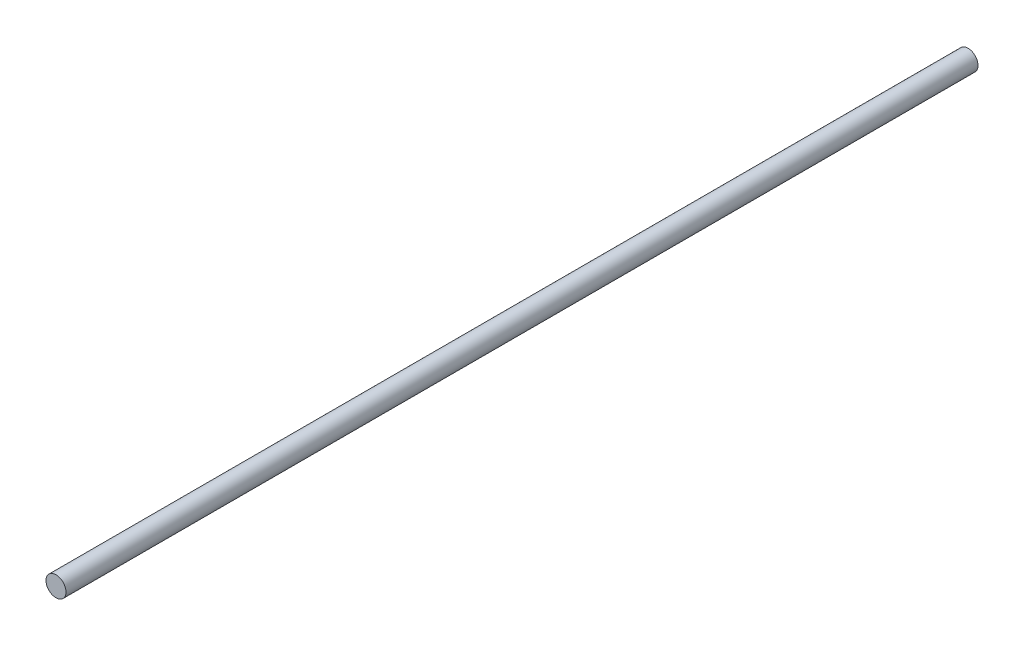
ISO-10303-21;
HEADER;
FILE_DESCRIPTION(('STEP AP214'),'2;1');
FILE_NAME('part.step','',(''),(''),'','','');
FILE_SCHEMA(('AUTOMOTIVE_DESIGN { 1 0 10303 214 1 1 1 1 }'));
ENDSEC;
DATA;
#1=APPLICATION_CONTEXT('core data for automotive mechanical design processes');
#2=APPLICATION_PROTOCOL_DEFINITION('international standard','automotive_design',2000,#1);
#3=PRODUCT_CONTEXT('',#1,'mechanical');
#4=PRODUCT('Part','Part','',(#3));
#5=PRODUCT_RELATED_PRODUCT_CATEGORY('part','',(#4));
#6=PRODUCT_DEFINITION_FORMATION('','',#4);
#7=PRODUCT_DEFINITION_CONTEXT('part definition',#1,'design');
#8=PRODUCT_DEFINITION('design','',#6,#7);
#9=PRODUCT_DEFINITION_SHAPE('','',#8);
#10=(LENGTH_UNIT() NAMED_UNIT(*) SI_UNIT(.MILLI.,.METRE.));
#11=(NAMED_UNIT(*) PLANE_ANGLE_UNIT() SI_UNIT($,.RADIAN.));
#12=(NAMED_UNIT(*) SI_UNIT($,.STERADIAN.) SOLID_ANGLE_UNIT());
#13=UNCERTAINTY_MEASURE_WITH_UNIT(LENGTH_MEASURE(1.E-05),#10,'distance_accuracy_value','');
#14=(GEOMETRIC_REPRESENTATION_CONTEXT(3) GLOBAL_UNCERTAINTY_ASSIGNED_CONTEXT((#13)) GLOBAL_UNIT_ASSIGNED_CONTEXT((#10,
#11,#12)) REPRESENTATION_CONTEXT('',''));
#15=CARTESIAN_POINT('',(0.,0.,0.));
#16=DIRECTION('',(0.,0.,1.));
#17=DIRECTION('',(1.,0.,0.));
#18=AXIS2_PLACEMENT_3D('',#15,#16,#17);
#19=CARTESIAN_POINT('',(0.,0.,365.));
#20=DIRECTION('',(0.,0.,-1.));
#21=DIRECTION('',(-1.,0.,0.));
#22=AXIS2_PLACEMENT_3D('',#19,#20,#21);
#23=CYLINDRICAL_SURFACE('',#22,4.);
#24=CARTESIAN_POINT('',(0.,0.,365.));
#25=DIRECTION('',(0.,0.,1.));
#26=DIRECTION('',(1.,0.,0.));
#27=AXIS2_PLACEMENT_3D('',#24,#25,#26);
#28=CIRCLE('',#27,4.);
#29=CARTESIAN_POINT('',(-4.,0.,365.));
#30=VERTEX_POINT('',#29);
#31=EDGE_CURVE('E10',#30,#30,#28,.T.);
#32=CARTESIAN_POINT('',(0.,0.,0.));
#33=DIRECTION('',(0.,0.,1.));
#34=DIRECTION('',(1.,0.,0.));
#35=AXIS2_PLACEMENT_3D('',#32,#33,#34);
#36=CIRCLE('',#35,4.);
#37=CARTESIAN_POINT('',(-4.,0.,0.));
#38=VERTEX_POINT('',#37);
#39=EDGE_CURVE('E40',#38,#38,#36,.T.);
#40=CARTESIAN_POINT('',(-4.,0.,365.));
#41=CARTESIAN_POINT('',(-4.,0.,361.197916666667));
#42=CARTESIAN_POINT('',(-4.,0.,357.395833333333));
#43=CARTESIAN_POINT('',(-4.,0.,349.791666666667));
#44=CARTESIAN_POINT('',(-4.,0.,345.989583333333));
#45=CARTESIAN_POINT('',(-4.,0.,338.385416666667));
#46=CARTESIAN_POINT('',(-4.,0.,334.583333333333));
#47=CARTESIAN_POINT('',(-4.,0.,326.979166666667));
#48=CARTESIAN_POINT('',(-4.,0.,323.177083333333));
#49=CARTESIAN_POINT('',(-4.,0.,315.572916666667));
#50=CARTESIAN_POINT('',(-4.,0.,311.770833333333));
#51=CARTESIAN_POINT('',(-4.,0.,304.166666666667));
#52=CARTESIAN_POINT('',(-4.,0.,300.364583333333));
#53=CARTESIAN_POINT('',(-4.,0.,292.760416666667));
#54=CARTESIAN_POINT('',(-4.,0.,288.958333333333));
#55=CARTESIAN_POINT('',(-4.,0.,281.354166666667));
#56=CARTESIAN_POINT('',(-4.,0.,277.552083333333));
#57=CARTESIAN_POINT('',(-4.,0.,269.947916666667));
#58=CARTESIAN_POINT('',(-4.,0.,266.145833333333));
#59=CARTESIAN_POINT('',(-4.,0.,258.541666666667));
#60=CARTESIAN_POINT('',(-4.,0.,254.739583333333));
#61=CARTESIAN_POINT('',(-4.,0.,247.135416666667));
#62=CARTESIAN_POINT('',(-4.,0.,243.333333333333));
#63=CARTESIAN_POINT('',(-4.,0.,235.729166666667));
#64=CARTESIAN_POINT('',(-4.,0.,231.927083333333));
#65=CARTESIAN_POINT('',(-4.,0.,224.322916666667));
#66=CARTESIAN_POINT('',(-4.,0.,220.520833333333));
#67=CARTESIAN_POINT('',(-4.,0.,212.916666666667));
#68=CARTESIAN_POINT('',(-4.,0.,209.114583333333));
#69=CARTESIAN_POINT('',(-4.,0.,201.510416666667));
#70=CARTESIAN_POINT('',(-4.,0.,197.708333333333));
#71=CARTESIAN_POINT('',(-4.,0.,190.104166666667));
#72=CARTESIAN_POINT('',(-4.,0.,186.302083333333));
#73=CARTESIAN_POINT('',(-4.,0.,178.697916666667));
#74=CARTESIAN_POINT('',(-4.,0.,174.895833333333));
#75=CARTESIAN_POINT('',(-4.,0.,167.291666666667));
#76=CARTESIAN_POINT('',(-4.,0.,163.489583333333));
#77=CARTESIAN_POINT('',(-4.,0.,155.885416666667));
#78=CARTESIAN_POINT('',(-4.,0.,152.083333333333));
#79=CARTESIAN_POINT('',(-4.,0.,144.479166666667));
#80=CARTESIAN_POINT('',(-4.,0.,140.677083333333));
#81=CARTESIAN_POINT('',(-4.,0.,133.072916666667));
#82=CARTESIAN_POINT('',(-4.,0.,129.270833333333));
#83=CARTESIAN_POINT('',(-4.,0.,121.666666666667));
#84=CARTESIAN_POINT('',(-4.,0.,117.864583333333));
#85=CARTESIAN_POINT('',(-4.,0.,110.260416666667));
#86=CARTESIAN_POINT('',(-4.,0.,106.458333333333));
#87=CARTESIAN_POINT('',(-4.,0.,98.8541666666666));
#88=CARTESIAN_POINT('',(-4.,0.,95.0520833333333));
#89=CARTESIAN_POINT('',(-4.,0.,87.4479166666666));
#90=CARTESIAN_POINT('',(-4.,0.,83.6458333333333));
#91=CARTESIAN_POINT('',(-4.,0.,76.0416666666666));
#92=CARTESIAN_POINT('',(-4.,0.,72.2395833333333));
#93=CARTESIAN_POINT('',(-4.,0.,64.6354166666666));
#94=CARTESIAN_POINT('',(-4.,0.,60.8333333333333));
#95=CARTESIAN_POINT('',(-4.,0.,53.2291666666666));
#96=CARTESIAN_POINT('',(-4.,0.,49.4270833333333));
#97=CARTESIAN_POINT('',(-4.,0.,41.8229166666666));
#98=CARTESIAN_POINT('',(-4.,0.,38.0208333333333));
#99=CARTESIAN_POINT('',(-4.,0.,30.4166666666666));
#100=CARTESIAN_POINT('',(-4.,0.,26.6145833333333));
#101=CARTESIAN_POINT('',(-4.,0.,19.0104166666666));
#102=CARTESIAN_POINT('',(-4.,0.,15.2083333333333));
#103=CARTESIAN_POINT('',(-4.,0.,7.60416666666662));
#104=CARTESIAN_POINT('',(-4.,0.,3.80208333333328));
#105=CARTESIAN_POINT('',(-4.,0.,0.));
#106=B_SPLINE_CURVE_WITH_KNOTS('',3,(#40,#41,#42,#43,#44,#45,#46,#47,#48,#49,#50,#51,#52,#53,
#54,#55,#56,#57,#58,#59,#60,#61,#62,#63,#64,#65,#66,#67,#68,#69,#70,#71,#72,#73,#74,#75,#76,#77,
#78,#79,#80,#81,#82,#83,#84,#85,#86,#87,#88,#89,#90,#91,#92,#93,#94,#95,#96,#97,#98,#99,#100,
#101,#102,#103,#104,#105),.UNSPECIFIED.,.F.,.F.,(4,2,2,2,2,2,2,2,2,2,2,2,2,2,2,2,2,2,2,2,2,2,2,
2,2,2,2,2,2,2,2,2,4),(0.,11.40625,22.8125,34.21875,45.625,57.03125,68.4375,79.8437499999999,
91.25,102.65625,114.0625,125.46875,136.875,148.28125,159.6875,171.09375,182.5,193.90625,
205.3125,216.71875,228.125,239.53125,250.9375,262.34375,273.75,285.15625,296.5625,307.96875,
319.375,330.78125,342.1875,353.59375,365.),.UNSPECIFIED.);
#107=EDGE_CURVE('BSEAM37',#30,#38,#106,.T.);
#108=ORIENTED_EDGE('',*,*,#31,.F.);
#109=ORIENTED_EDGE('',*,*,#39,.T.);
#110=ORIENTED_EDGE('',*,*,#107,.T.);
#111=ORIENTED_EDGE('',*,*,#107,.F.);
#112=EDGE_LOOP('',(#108,#110,#109,#111));
#113=FACE_BOUND('',#112,.T.);
#114=ADVANCED_FACE('F37',(#113),#23,.T.);
#115=CARTESIAN_POINT('',(0.,0.,365.));
#116=DIRECTION('',(0.,0.,1.));
#117=DIRECTION('',(1.,0.,0.));
#118=AXIS2_PLACEMENT_3D('',#115,#116,#117);
#119=PLANE('',#118);
#120=ORIENTED_EDGE('',*,*,#31,.T.);
#121=EDGE_LOOP('',(#120));
#122=FACE_BOUND('',#121,.T.);
#123=ADVANCED_FACE('F54',(#122),#119,.T.);
#124=CARTESIAN_POINT('',(0.,0.,0.));
#125=DIRECTION('',(0.,0.,1.));
#126=DIRECTION('',(1.,0.,0.));
#127=AXIS2_PLACEMENT_3D('',#124,#125,#126);
#128=PLANE('',#127);
#129=ORIENTED_EDGE('',*,*,#39,.F.);
#130=EDGE_LOOP('',(#129));
#131=FACE_BOUND('',#130,.T.);
#132=ADVANCED_FACE('F52',(#131),#128,.F.);
#133=CLOSED_SHELL('',(#114,#123,#132));
#134=MANIFOLD_SOLID_BREP('B2',#133);
#135=ADVANCED_BREP_SHAPE_REPRESENTATION('',(#18,#134),#14);
#136=SHAPE_DEFINITION_REPRESENTATION(#9,#135);
ENDSEC;
END-ISO-10303-21;
